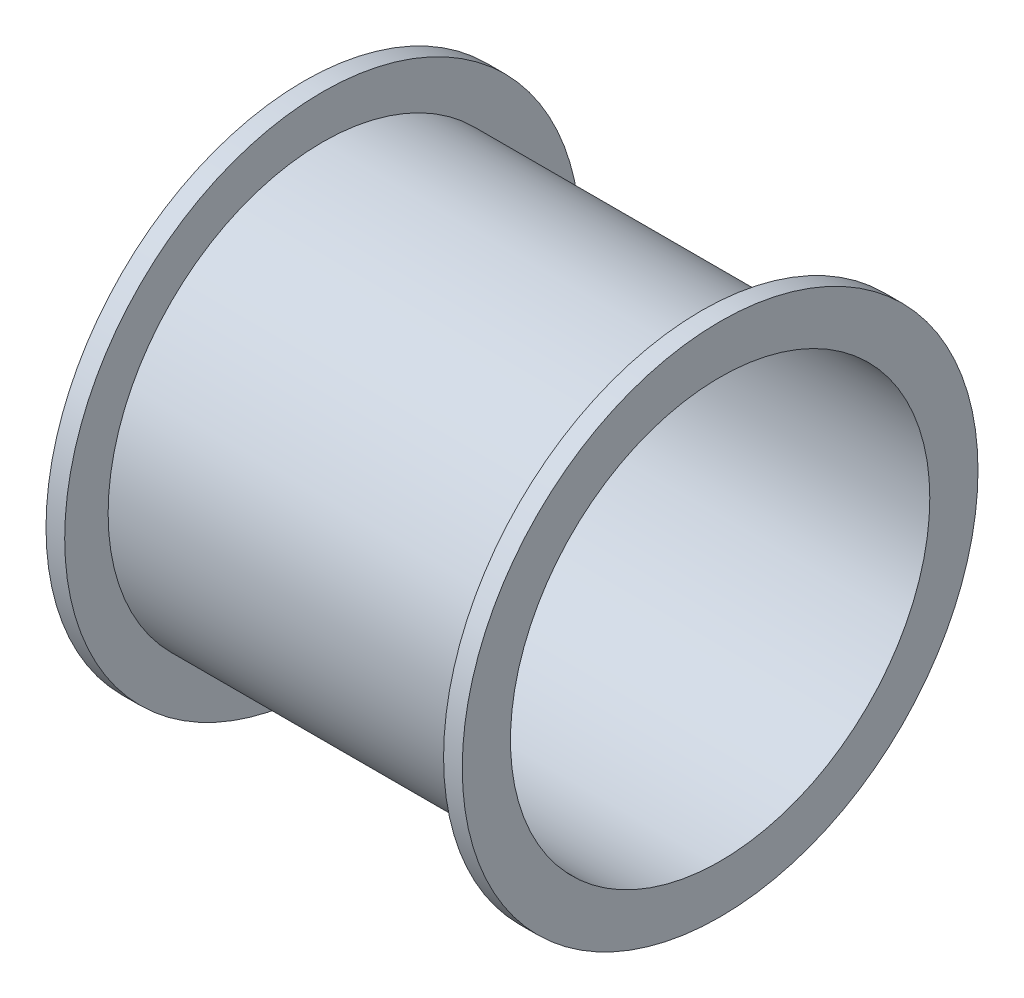
ISO-10303-21;
HEADER;
FILE_DESCRIPTION(('STEP AP214'),'2;1');
FILE_NAME('part.step','',(''),(''),'','','');
FILE_SCHEMA(('AUTOMOTIVE_DESIGN { 1 0 10303 214 1 1 1 1 }'));
ENDSEC;
DATA;
#1=APPLICATION_CONTEXT('core data for automotive mechanical design processes');
#2=APPLICATION_PROTOCOL_DEFINITION('international standard','automotive_design',2000,#1);
#3=PRODUCT_CONTEXT('',#1,'mechanical');
#4=PRODUCT('Part','Part','',(#3));
#5=PRODUCT_RELATED_PRODUCT_CATEGORY('part','',(#4));
#6=PRODUCT_DEFINITION_FORMATION('','',#4);
#7=PRODUCT_DEFINITION_CONTEXT('part definition',#1,'design');
#8=PRODUCT_DEFINITION('design','',#6,#7);
#9=PRODUCT_DEFINITION_SHAPE('','',#8);
#10=(LENGTH_UNIT() NAMED_UNIT(*) SI_UNIT(.MILLI.,.METRE.));
#11=(NAMED_UNIT(*) PLANE_ANGLE_UNIT() SI_UNIT($,.RADIAN.));
#12=(NAMED_UNIT(*) SI_UNIT($,.STERADIAN.) SOLID_ANGLE_UNIT());
#13=UNCERTAINTY_MEASURE_WITH_UNIT(LENGTH_MEASURE(1.E-05),#10,'distance_accuracy_value','');
#14=(GEOMETRIC_REPRESENTATION_CONTEXT(3) GLOBAL_UNCERTAINTY_ASSIGNED_CONTEXT((#13)) GLOBAL_UNIT_ASSIGNED_CONTEXT((#10,
#11,#12)) REPRESENTATION_CONTEXT('',''));
#15=CARTESIAN_POINT('',(0.,0.,0.));
#16=DIRECTION('',(0.,0.,1.));
#17=DIRECTION('',(1.,0.,0.));
#18=AXIS2_PLACEMENT_3D('',#15,#16,#17);
#19=CARTESIAN_POINT('',(103.,0.,0.));
#20=DIRECTION('',(-1.,0.,0.));
#21=DIRECTION('',(0.,0.,1.));
#22=AXIS2_PLACEMENT_3D('',#19,#20,#21);
#23=CYLINDRICAL_SURFACE('',#22,58.3);
#24=CARTESIAN_POINT('',(103.,0.,0.));
#25=DIRECTION('',(1.,0.,0.));
#26=DIRECTION('',(0.,0.,-1.));
#27=AXIS2_PLACEMENT_3D('',#24,#25,#26);
#28=CIRCLE('',#27,58.3);
#29=CARTESIAN_POINT('',(103.,0.,-58.3));
#30=VERTEX_POINT('',#29);
#31=EDGE_CURVE('E10',#30,#30,#28,.T.);
#32=ORIENTED_EDGE('',*,*,#31,.F.);
#33=EDGE_LOOP('',(#32));
#34=FACE_BOUND('',#33,.T.);
#35=CARTESIAN_POINT('',(0.,0.,0.));
#36=DIRECTION('',(1.,0.,0.));
#37=DIRECTION('',(0.,0.,-1.));
#38=AXIS2_PLACEMENT_3D('',#35,#36,#37);
#39=CIRCLE('',#38,58.3);
#40=CARTESIAN_POINT('',(0.,0.,-58.3));
#41=VERTEX_POINT('',#40);
#42=EDGE_CURVE('E46',#41,#41,#39,.T.);
#43=ORIENTED_EDGE('',*,*,#42,.T.);
#44=EDGE_LOOP('',(#43));
#45=FACE_BOUND('',#44,.T.);
#46=ADVANCED_FACE('F43',(#34,#45),#23,.T.);
#47=CARTESIAN_POINT('',(-5.08,0.,0.));
#48=DIRECTION('',(1.,0.,0.));
#49=DIRECTION('',(0.,0.,-1.));
#50=AXIS2_PLACEMENT_3D('',#47,#48,#49);
#51=CYLINDRICAL_SURFACE('',#50,70.1085);
#52=CARTESIAN_POINT('',(-5.08,0.,0.));
#53=DIRECTION('',(1.,0.,0.));
#54=DIRECTION('',(0.,0.,-1.));
#55=AXIS2_PLACEMENT_3D('',#52,#53,#54);
#56=CIRCLE('',#55,70.1085);
#57=CARTESIAN_POINT('',(-5.08,0.,-70.1085));
#58=VERTEX_POINT('',#57);
#59=EDGE_CURVE('E62',#58,#58,#56,.T.);
#60=ORIENTED_EDGE('',*,*,#59,.T.);
#61=EDGE_LOOP('',(#60));
#62=FACE_BOUND('',#61,.T.);
#63=CARTESIAN_POINT('',(0.,0.,0.));
#64=DIRECTION('',(1.,0.,0.));
#65=DIRECTION('',(0.,0.,-1.));
#66=AXIS2_PLACEMENT_3D('',#63,#64,#65);
#67=CIRCLE('',#66,70.1085);
#68=CARTESIAN_POINT('',(0.,0.,-70.1085));
#69=VERTEX_POINT('',#68);
#70=EDGE_CURVE('E58',#69,#69,#67,.T.);
#71=ORIENTED_EDGE('',*,*,#70,.F.);
#72=EDGE_LOOP('',(#71));
#73=FACE_BOUND('',#72,.T.);
#74=ADVANCED_FACE('F134',(#62,#73),#51,.T.);
#75=CARTESIAN_POINT('',(-5.08,0.,0.));
#76=DIRECTION('',(1.,0.,0.));
#77=DIRECTION('',(0.,0.,-1.));
#78=AXIS2_PLACEMENT_3D('',#75,#76,#77);
#79=PLANE('',#78);
#80=ORIENTED_EDGE('',*,*,#59,.F.);
#81=EDGE_LOOP('',(#80));
#82=FACE_BOUND('',#81,.T.);
#83=ADVANCED_FACE('F130',(#82),#79,.F.);
#84=CARTESIAN_POINT('',(0.,0.,0.));
#85=DIRECTION('',(1.,0.,0.));
#86=DIRECTION('',(0.,0.,-1.));
#87=AXIS2_PLACEMENT_3D('',#84,#85,#86);
#88=PLANE('',#87);
#89=ORIENTED_EDGE('',*,*,#42,.F.);
#90=EDGE_LOOP('',(#89));
#91=FACE_BOUND('',#90,.T.);
#92=ORIENTED_EDGE('',*,*,#70,.T.);
#93=EDGE_LOOP('',(#92));
#94=FACE_BOUND('',#93,.T.);
#95=ADVANCED_FACE('F110',(#91,#94),#88,.T.);
#96=CARTESIAN_POINT('',(108.08,0.,0.));
#97=DIRECTION('',(1.,0.,0.));
#98=DIRECTION('',(0.,0.,-1.));
#99=AXIS2_PLACEMENT_3D('',#96,#97,#98);
#100=PLANE('',#99);
#101=CARTESIAN_POINT('',(108.08,0.,0.));
#102=DIRECTION('',(1.,0.,0.));
#103=DIRECTION('',(0.,0.,-1.));
#104=AXIS2_PLACEMENT_3D('',#101,#102,#103);
#105=CIRCLE('',#104,70.104);
#106=CARTESIAN_POINT('',(108.08,0.,-70.104));
#107=VERTEX_POINT('',#106);
#108=EDGE_CURVE('E63',#107,#107,#105,.T.);
#109=ORIENTED_EDGE('',*,*,#108,.T.);
#110=EDGE_LOOP('',(#109));
#111=FACE_BOUND('',#110,.T.);
#112=CARTESIAN_POINT('',(108.08,0.,0.));
#113=DIRECTION('',(1.,0.,0.));
#114=DIRECTION('',(0.,0.,-1.));
#115=AXIS2_PLACEMENT_3D('',#112,#113,#114);
#116=CIRCLE('',#115,57.);
#117=CARTESIAN_POINT('',(108.08,0.,-57.));
#118=VERTEX_POINT('',#117);
#119=EDGE_CURVE('E71',#118,#118,#116,.T.);
#120=ORIENTED_EDGE('',*,*,#119,.F.);
#121=EDGE_LOOP('',(#120));
#122=FACE_BOUND('',#121,.T.);
#123=ADVANCED_FACE('F120',(#111,#122),#100,.T.);
#124=CARTESIAN_POINT('',(103.,0.,0.));
#125=DIRECTION('',(1.,0.,0.));
#126=DIRECTION('',(0.,0.,-1.));
#127=AXIS2_PLACEMENT_3D('',#124,#125,#126);
#128=PLANE('',#127);
#129=ORIENTED_EDGE('',*,*,#31,.T.);
#130=EDGE_LOOP('',(#129));
#131=FACE_BOUND('',#130,.T.);
#132=CARTESIAN_POINT('',(103.,0.,0.));
#133=DIRECTION('',(1.,0.,0.));
#134=DIRECTION('',(0.,0.,-1.));
#135=AXIS2_PLACEMENT_3D('',#132,#133,#134);
#136=CIRCLE('',#135,70.104);
#137=CARTESIAN_POINT('',(103.,0.,-70.104));
#138=VERTEX_POINT('',#137);
#139=EDGE_CURVE('E67',#138,#138,#136,.T.);
#140=ORIENTED_EDGE('',*,*,#139,.F.);
#141=EDGE_LOOP('',(#140));
#142=FACE_BOUND('',#141,.T.);
#143=ADVANCED_FACE('F122',(#131,#142),#128,.F.);
#144=CARTESIAN_POINT('',(108.08,0.,0.));
#145=DIRECTION('',(-1.,0.,0.));
#146=DIRECTION('',(0.,0.,1.));
#147=AXIS2_PLACEMENT_3D('',#144,#145,#146);
#148=CYLINDRICAL_SURFACE('',#147,70.104);
#149=ORIENTED_EDGE('',*,*,#108,.F.);
#150=EDGE_LOOP('',(#149));
#151=FACE_BOUND('',#150,.T.);
#152=ORIENTED_EDGE('',*,*,#139,.T.);
#153=EDGE_LOOP('',(#152));
#154=FACE_BOUND('',#153,.T.);
#155=ADVANCED_FACE('F108',(#151,#154),#148,.T.);
#156=CARTESIAN_POINT('',(0.,0.,25.380174480377));
#157=DIRECTION('',(1.,0.,0.));
#158=DIRECTION('',(0.,0.,-1.));
#159=AXIS2_PLACEMENT_3D('',#156,#157,#158);
#160=CIRCLE('',#159,17.2357901321963);
#161=CARTESIAN_POINT('',(0.,0.,42.6159646125733));
#162=VERTEX_POINT('',#161);
#163=EDGE_CURVE('E87',#162,#162,#160,.T.);
#164=ORIENTED_EDGE('',*,*,#163,.F.);
#165=EDGE_LOOP('',(#164));
#166=FACE_BOUND('',#165,.T.);
#167=CARTESIAN_POINT('',(0.,0.,-25.380174480377));
#168=DIRECTION('',(1.,0.,0.));
#169=DIRECTION('',(0.,0.,-1.));
#170=AXIS2_PLACEMENT_3D('',#167,#168,#169);
#171=CIRCLE('',#170,17.2357901321963);
#172=CARTESIAN_POINT('',(0.,0.,-8.14438434818066));
#173=VERTEX_POINT('',#172);
#174=EDGE_CURVE('E83',#173,#173,#171,.T.);
#175=ORIENTED_EDGE('',*,*,#174,.F.);
#176=EDGE_LOOP('',(#175));
#177=FACE_BOUND('',#176,.T.);
#178=CARTESIAN_POINT('',(0.,0.,0.));
#179=DIRECTION('',(1.,0.,0.));
#180=DIRECTION('',(0.,0.,-1.));
#181=AXIS2_PLACEMENT_3D('',#178,#179,#180);
#182=CIRCLE('',#181,57.);
#183=CARTESIAN_POINT('',(0.,0.,-57.));
#184=VERTEX_POINT('',#183);
#185=EDGE_CURVE('E51',#184,#184,#182,.T.);
#186=ORIENTED_EDGE('',*,*,#185,.T.);
#187=EDGE_LOOP('',(#186));
#188=FACE_BOUND('',#187,.T.);
#189=ADVANCED_FACE('F104',(#166,#177,#188),#88,.T.);
#190=CARTESIAN_POINT('',(103.,0.,0.));
#191=DIRECTION('',(-1.,0.,0.));
#192=DIRECTION('',(0.,0.,1.));
#193=AXIS2_PLACEMENT_3D('',#190,#191,#192);
#194=CYLINDRICAL_SURFACE('',#193,57.);
#195=ORIENTED_EDGE('',*,*,#185,.F.);
#196=EDGE_LOOP('',(#195));
#197=FACE_BOUND('',#196,.T.);
#198=ORIENTED_EDGE('',*,*,#119,.T.);
#199=EDGE_LOOP('',(#198));
#200=FACE_BOUND('',#199,.T.);
#201=ADVANCED_FACE('F107',(#197,#200),#194,.F.);
#202=CARTESIAN_POINT('',(7.62,0.,-25.380174480377));
#203=DIRECTION('',(-1.,0.,0.));
#204=DIRECTION('',(0.,0.,1.));
#205=AXIS2_PLACEMENT_3D('',#202,#203,#204);
#206=CYLINDRICAL_SURFACE('',#205,17.2357901321963);
#207=CARTESIAN_POINT('',(7.62,0.,-25.380174480377));
#208=DIRECTION('',(1.,0.,0.));
#209=DIRECTION('',(0.,0.,-1.));
#210=AXIS2_PLACEMENT_3D('',#207,#208,#209);
#211=CIRCLE('',#210,17.2357901321963);
#212=CARTESIAN_POINT('',(7.62,0.,-8.14438434818066));
#213=VERTEX_POINT('',#212);
#214=EDGE_CURVE('E79',#213,#213,#211,.T.);
#215=CARTESIAN_POINT('',(7.62,0.,-8.14438434818066));
#216=CARTESIAN_POINT('',(7.540625,0.,-8.14438434818066));
#217=CARTESIAN_POINT('',(7.46125,0.,-8.14438434818066));
#218=CARTESIAN_POINT('',(7.3025,0.,-8.14438434818066));
#219=CARTESIAN_POINT('',(7.223125,0.,-8.14438434818066));
#220=CARTESIAN_POINT('',(7.064375,0.,-8.14438434818066));
#221=CARTESIAN_POINT('',(6.985,0.,-8.14438434818066));
#222=CARTESIAN_POINT('',(6.82625,0.,-8.14438434818066));
#223=CARTESIAN_POINT('',(6.746875,0.,-8.14438434818066));
#224=CARTESIAN_POINT('',(6.588125,0.,-8.14438434818066));
#225=CARTESIAN_POINT('',(6.50875,0.,-8.14438434818066));
#226=CARTESIAN_POINT('',(6.35,0.,-8.14438434818066));
#227=CARTESIAN_POINT('',(6.270625,0.,-8.14438434818066));
#228=CARTESIAN_POINT('',(6.111875,0.,-8.14438434818066));
#229=CARTESIAN_POINT('',(6.0325,0.,-8.14438434818066));
#230=CARTESIAN_POINT('',(5.87375,0.,-8.14438434818066));
#231=CARTESIAN_POINT('',(5.794375,0.,-8.14438434818066));
#232=CARTESIAN_POINT('',(5.635625,0.,-8.14438434818066));
#233=CARTESIAN_POINT('',(5.55625,0.,-8.14438434818066));
#234=CARTESIAN_POINT('',(5.3975,0.,-8.14438434818066));
#235=CARTESIAN_POINT('',(5.318125,0.,-8.14438434818066));
#236=CARTESIAN_POINT('',(5.159375,0.,-8.14438434818066));
#237=CARTESIAN_POINT('',(5.08,0.,-8.14438434818066));
#238=CARTESIAN_POINT('',(4.92125,0.,-8.14438434818066));
#239=CARTESIAN_POINT('',(4.841875,0.,-8.14438434818066));
#240=CARTESIAN_POINT('',(4.683125,0.,-8.14438434818066));
#241=CARTESIAN_POINT('',(4.60375,0.,-8.14438434818066));
#242=CARTESIAN_POINT('',(4.445,0.,-8.14438434818066));
#243=CARTESIAN_POINT('',(4.365625,0.,-8.14438434818066));
#244=CARTESIAN_POINT('',(4.206875,0.,-8.14438434818066));
#245=CARTESIAN_POINT('',(4.1275,0.,-8.14438434818066));
#246=CARTESIAN_POINT('',(3.96875,0.,-8.14438434818066));
#247=CARTESIAN_POINT('',(3.889375,0.,-8.14438434818066));
#248=CARTESIAN_POINT('',(3.730625,0.,-8.14438434818066));
#249=CARTESIAN_POINT('',(3.65125,0.,-8.14438434818066));
#250=CARTESIAN_POINT('',(3.4925,0.,-8.14438434818066));
#251=CARTESIAN_POINT('',(3.413125,0.,-8.14438434818066));
#252=CARTESIAN_POINT('',(3.254375,0.,-8.14438434818066));
#253=CARTESIAN_POINT('',(3.175,0.,-8.14438434818066));
#254=CARTESIAN_POINT('',(3.01625,0.,-8.14438434818066));
#255=CARTESIAN_POINT('',(2.936875,0.,-8.14438434818066));
#256=CARTESIAN_POINT('',(2.778125,0.,-8.14438434818066));
#257=CARTESIAN_POINT('',(2.69875,0.,-8.14438434818066));
#258=CARTESIAN_POINT('',(2.54,0.,-8.14438434818066));
#259=CARTESIAN_POINT('',(2.460625,0.,-8.14438434818066));
#260=CARTESIAN_POINT('',(2.301875,0.,-8.14438434818066));
#261=CARTESIAN_POINT('',(2.2225,0.,-8.14438434818066));
#262=CARTESIAN_POINT('',(2.06375,0.,-8.14438434818066));
#263=CARTESIAN_POINT('',(1.984375,0.,-8.14438434818066));
#264=CARTESIAN_POINT('',(1.825625,0.,-8.14438434818066));
#265=CARTESIAN_POINT('',(1.74625,0.,-8.14438434818066));
#266=CARTESIAN_POINT('',(1.5875,0.,-8.14438434818066));
#267=CARTESIAN_POINT('',(1.508125,0.,-8.14438434818066));
#268=CARTESIAN_POINT('',(1.349375,0.,-8.14438434818066));
#269=CARTESIAN_POINT('',(1.27,0.,-8.14438434818066));
#270=CARTESIAN_POINT('',(1.11125,0.,-8.14438434818066));
#271=CARTESIAN_POINT('',(1.031875,0.,-8.14438434818066));
#272=CARTESIAN_POINT('',(0.873125,0.,-8.14438434818066));
#273=CARTESIAN_POINT('',(0.79375,0.,-8.14438434818066));
#274=CARTESIAN_POINT('',(0.635,0.,-8.14438434818066));
#275=CARTESIAN_POINT('',(0.555625,0.,-8.14438434818066));
#276=CARTESIAN_POINT('',(0.396875,0.,-8.14438434818066));
#277=CARTESIAN_POINT('',(0.3175,0.,-8.14438434818066));
#278=CARTESIAN_POINT('',(0.15875,0.,-8.14438434818066));
#279=CARTESIAN_POINT('',(0.0793749999999999,0.,-8.14438434818066));
#280=CARTESIAN_POINT('',(0.,0.,-8.14438434818066));
#281=B_SPLINE_CURVE_WITH_KNOTS('',3,(#215,#216,#217,#218,#219,#220,#221,#222,#223,#224,#225,
#226,#227,#228,#229,#230,#231,#232,#233,#234,#235,#236,#237,#238,#239,#240,#241,#242,#243,#244,
#245,#246,#247,#248,#249,#250,#251,#252,#253,#254,#255,#256,#257,#258,#259,#260,#261,#262,#263,
#264,#265,#266,#267,#268,#269,#270,#271,#272,#273,#274,#275,#276,#277,#278,#279,#280),
.UNSPECIFIED.,.F.,.F.,(4,2,2,2,2,2,2,2,2,2,2,2,2,2,2,2,2,2,2,2,2,2,2,2,2,2,2,2,2,2,2,2,4),(0.,
0.238125,0.476249999999999,0.714375,0.952499999999999,1.190625,1.42875,1.666875,1.905,2.143125,
2.38125,2.619375,2.8575,3.095625,3.33375,3.571875,3.81,4.048125,4.28625,4.524375,4.7625,
5.000625,5.23875,5.476875,5.715,5.953125,6.19125,6.429375,6.6675,6.905625,7.14375,7.381875,
7.62),.UNSPECIFIED.);
#282=EDGE_CURVE('BSEAM117',#213,#173,#281,.T.);
#283=ORIENTED_EDGE('',*,*,#214,.F.);
#284=ORIENTED_EDGE('',*,*,#174,.T.);
#285=ORIENTED_EDGE('',*,*,#282,.T.);
#286=ORIENTED_EDGE('',*,*,#282,.F.);
#287=EDGE_LOOP('',(#283,#285,#284,#286));
#288=FACE_BOUND('',#287,.T.);
#289=ADVANCED_FACE('F117',(#288),#206,.T.);
#290=CARTESIAN_POINT('',(7.62,0.,-25.380174480377));
#291=DIRECTION('',(1.,0.,0.));
#292=DIRECTION('',(0.,0.,-1.));
#293=AXIS2_PLACEMENT_3D('',#290,#291,#292);
#294=PLANE('',#293);
#295=ORIENTED_EDGE('',*,*,#214,.T.);
#296=EDGE_LOOP('',(#295));
#297=FACE_BOUND('',#296,.T.);
#298=ADVANCED_FACE('F100',(#297),#294,.T.);
#299=CARTESIAN_POINT('',(7.62,0.,25.380174480377));
#300=DIRECTION('',(-1.,0.,0.));
#301=DIRECTION('',(0.,0.,1.));
#302=AXIS2_PLACEMENT_3D('',#299,#300,#301);
#303=CYLINDRICAL_SURFACE('',#302,17.2357901321963);
#304=CARTESIAN_POINT('',(7.62,0.,25.380174480377));
#305=DIRECTION('',(1.,0.,0.));
#306=DIRECTION('',(0.,0.,-1.));
#307=AXIS2_PLACEMENT_3D('',#304,#305,#306);
#308=CIRCLE('',#307,17.2357901321963);
#309=CARTESIAN_POINT('',(7.62,0.,42.6159646125733));
#310=VERTEX_POINT('',#309);
#311=EDGE_CURVE('E78',#310,#310,#308,.T.);
#312=CARTESIAN_POINT('',(7.62,0.,42.6159646125733));
#313=CARTESIAN_POINT('',(7.540625,0.,42.6159646125733));
#314=CARTESIAN_POINT('',(7.46125,0.,42.6159646125733));
#315=CARTESIAN_POINT('',(7.3025,0.,42.6159646125733));
#316=CARTESIAN_POINT('',(7.223125,0.,42.6159646125733));
#317=CARTESIAN_POINT('',(7.064375,0.,42.6159646125733));
#318=CARTESIAN_POINT('',(6.985,0.,42.6159646125733));
#319=CARTESIAN_POINT('',(6.82625,0.,42.6159646125733));
#320=CARTESIAN_POINT('',(6.746875,0.,42.6159646125733));
#321=CARTESIAN_POINT('',(6.588125,0.,42.6159646125733));
#322=CARTESIAN_POINT('',(6.50875,0.,42.6159646125733));
#323=CARTESIAN_POINT('',(6.35,0.,42.6159646125733));
#324=CARTESIAN_POINT('',(6.270625,0.,42.6159646125733));
#325=CARTESIAN_POINT('',(6.111875,0.,42.6159646125733));
#326=CARTESIAN_POINT('',(6.0325,0.,42.6159646125733));
#327=CARTESIAN_POINT('',(5.87375,0.,42.6159646125733));
#328=CARTESIAN_POINT('',(5.794375,0.,42.6159646125733));
#329=CARTESIAN_POINT('',(5.635625,0.,42.6159646125733));
#330=CARTESIAN_POINT('',(5.55625,0.,42.6159646125733));
#331=CARTESIAN_POINT('',(5.3975,0.,42.6159646125733));
#332=CARTESIAN_POINT('',(5.318125,0.,42.6159646125733));
#333=CARTESIAN_POINT('',(5.159375,0.,42.6159646125733));
#334=CARTESIAN_POINT('',(5.08,0.,42.6159646125733));
#335=CARTESIAN_POINT('',(4.92125,0.,42.6159646125733));
#336=CARTESIAN_POINT('',(4.841875,0.,42.6159646125733));
#337=CARTESIAN_POINT('',(4.683125,0.,42.6159646125733));
#338=CARTESIAN_POINT('',(4.60375,0.,42.6159646125733));
#339=CARTESIAN_POINT('',(4.445,0.,42.6159646125733));
#340=CARTESIAN_POINT('',(4.365625,0.,42.6159646125733));
#341=CARTESIAN_POINT('',(4.206875,0.,42.6159646125733));
#342=CARTESIAN_POINT('',(4.1275,0.,42.6159646125733));
#343=CARTESIAN_POINT('',(3.96875,0.,42.6159646125733));
#344=CARTESIAN_POINT('',(3.889375,0.,42.6159646125733));
#345=CARTESIAN_POINT('',(3.730625,0.,42.6159646125733));
#346=CARTESIAN_POINT('',(3.65125,0.,42.6159646125733));
#347=CARTESIAN_POINT('',(3.4925,0.,42.6159646125733));
#348=CARTESIAN_POINT('',(3.413125,0.,42.6159646125733));
#349=CARTESIAN_POINT('',(3.254375,0.,42.6159646125733));
#350=CARTESIAN_POINT('',(3.175,0.,42.6159646125733));
#351=CARTESIAN_POINT('',(3.01625,0.,42.6159646125733));
#352=CARTESIAN_POINT('',(2.936875,0.,42.6159646125733));
#353=CARTESIAN_POINT('',(2.778125,0.,42.6159646125733));
#354=CARTESIAN_POINT('',(2.69875,0.,42.6159646125733));
#355=CARTESIAN_POINT('',(2.54,0.,42.6159646125733));
#356=CARTESIAN_POINT('',(2.460625,0.,42.6159646125733));
#357=CARTESIAN_POINT('',(2.301875,0.,42.6159646125733));
#358=CARTESIAN_POINT('',(2.2225,0.,42.6159646125733));
#359=CARTESIAN_POINT('',(2.06375,0.,42.6159646125733));
#360=CARTESIAN_POINT('',(1.984375,0.,42.6159646125733));
#361=CARTESIAN_POINT('',(1.825625,0.,42.6159646125733));
#362=CARTESIAN_POINT('',(1.74625,0.,42.6159646125733));
#363=CARTESIAN_POINT('',(1.5875,0.,42.6159646125733));
#364=CARTESIAN_POINT('',(1.508125,0.,42.6159646125733));
#365=CARTESIAN_POINT('',(1.349375,0.,42.6159646125733));
#366=CARTESIAN_POINT('',(1.27,0.,42.6159646125733));
#367=CARTESIAN_POINT('',(1.11125,0.,42.6159646125733));
#368=CARTESIAN_POINT('',(1.031875,0.,42.6159646125733));
#369=CARTESIAN_POINT('',(0.873125,0.,42.6159646125733));
#370=CARTESIAN_POINT('',(0.79375,0.,42.6159646125733));
#371=CARTESIAN_POINT('',(0.635,0.,42.6159646125733));
#372=CARTESIAN_POINT('',(0.555625,0.,42.6159646125733));
#373=CARTESIAN_POINT('',(0.396875,0.,42.6159646125733));
#374=CARTESIAN_POINT('',(0.3175,0.,42.6159646125733));
#375=CARTESIAN_POINT('',(0.15875,0.,42.6159646125733));
#376=CARTESIAN_POINT('',(0.0793749999999999,0.,42.6159646125733));
#377=CARTESIAN_POINT('',(0.,0.,42.6159646125733));
#378=B_SPLINE_CURVE_WITH_KNOTS('',3,(#312,#313,#314,#315,#316,#317,#318,#319,#320,#321,#322,
#323,#324,#325,#326,#327,#328,#329,#330,#331,#332,#333,#334,#335,#336,#337,#338,#339,#340,#341,
#342,#343,#344,#345,#346,#347,#348,#349,#350,#351,#352,#353,#354,#355,#356,#357,#358,#359,#360,
#361,#362,#363,#364,#365,#366,#367,#368,#369,#370,#371,#372,#373,#374,#375,#376,#377),
.UNSPECIFIED.,.F.,.F.,(4,2,2,2,2,2,2,2,2,2,2,2,2,2,2,2,2,2,2,2,2,2,2,2,2,2,2,2,2,2,2,2,4),(0.,
0.238125,0.476249999999999,0.714375,0.952499999999999,1.190625,1.42875,1.666875,1.905,2.143125,
2.38125,2.619375,2.8575,3.095625,3.33375,3.571875,3.81,4.048125,4.28625,4.524375,4.7625,
5.000625,5.23875,5.476875,5.715,5.953125,6.19125,6.429375,6.6675,6.905625,7.14375,7.381875,
7.62),.UNSPECIFIED.);
#379=EDGE_CURVE('BSEAM97',#310,#162,#378,.T.);
#380=ORIENTED_EDGE('',*,*,#311,.F.);
#381=ORIENTED_EDGE('',*,*,#163,.T.);
#382=ORIENTED_EDGE('',*,*,#379,.T.);
#383=ORIENTED_EDGE('',*,*,#379,.F.);
#384=EDGE_LOOP('',(#380,#382,#381,#383));
#385=FACE_BOUND('',#384,.T.);
#386=ADVANCED_FACE('F97',(#385),#303,.T.);
#387=CARTESIAN_POINT('',(7.62,0.,25.380174480377));
#388=DIRECTION('',(1.,0.,0.));
#389=DIRECTION('',(0.,0.,-1.));
#390=AXIS2_PLACEMENT_3D('',#387,#388,#389);
#391=PLANE('',#390);
#392=ORIENTED_EDGE('',*,*,#311,.T.);
#393=EDGE_LOOP('',(#392));
#394=FACE_BOUND('',#393,.T.);
#395=ADVANCED_FACE('F95',(#394),#391,.T.);
#396=CLOSED_SHELL('',(#46,#74,#83,#95,#123,#143,#155,#189,#201,#289,#298,#386,#395));
#397=MANIFOLD_SOLID_BREP('B2',#396);
#398=ADVANCED_BREP_SHAPE_REPRESENTATION('',(#18,#397),#14);
#399=SHAPE_DEFINITION_REPRESENTATION(#9,#398);
ENDSEC;
END-ISO-10303-21;
